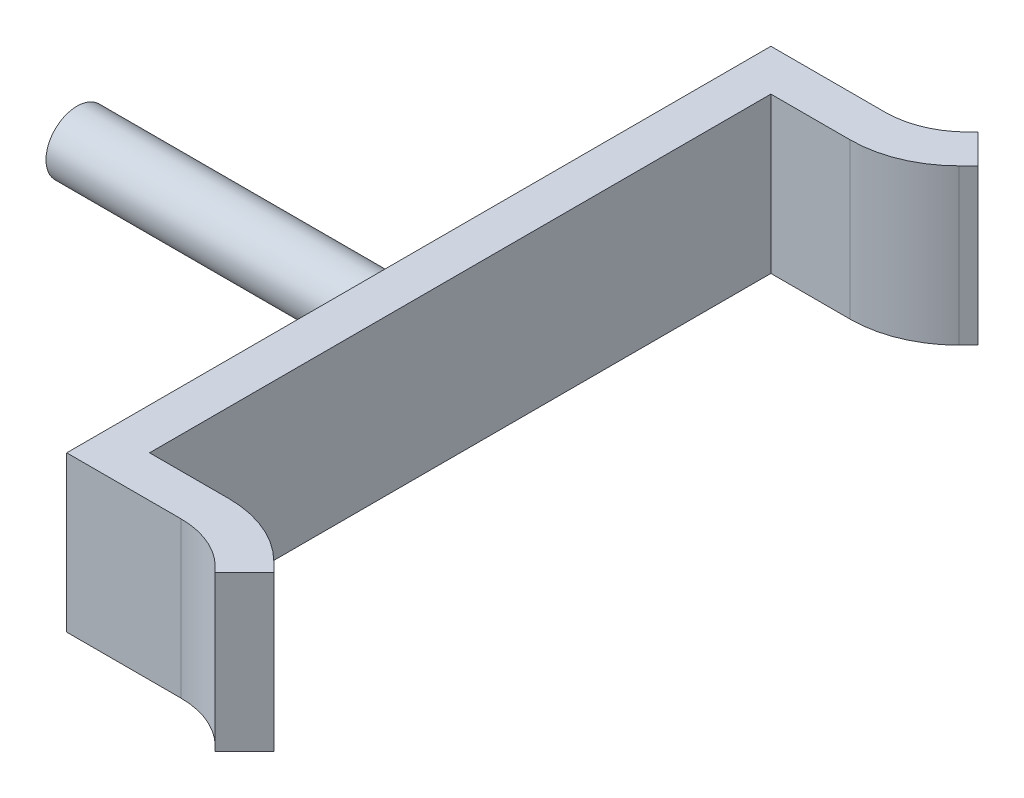
ISO-10303-21;
HEADER;
FILE_DESCRIPTION(('STEP AP214'),'2;1');
FILE_NAME('part.step','',(''),(''),'','','');
FILE_SCHEMA(('AUTOMOTIVE_DESIGN { 1 0 10303 214 1 1 1 1 }'));
ENDSEC;
DATA;
#1=APPLICATION_CONTEXT('core data for automotive mechanical design processes');
#2=APPLICATION_PROTOCOL_DEFINITION('international standard','automotive_design',2000,#1);
#3=PRODUCT_CONTEXT('',#1,'mechanical');
#4=PRODUCT('Part','Part','',(#3));
#5=PRODUCT_RELATED_PRODUCT_CATEGORY('part','',(#4));
#6=PRODUCT_DEFINITION_FORMATION('','',#4);
#7=PRODUCT_DEFINITION_CONTEXT('part definition',#1,'design');
#8=PRODUCT_DEFINITION('design','',#6,#7);
#9=PRODUCT_DEFINITION_SHAPE('','',#8);
#10=(LENGTH_UNIT() NAMED_UNIT(*) SI_UNIT(.MILLI.,.METRE.));
#11=(NAMED_UNIT(*) PLANE_ANGLE_UNIT() SI_UNIT($,.RADIAN.));
#12=(NAMED_UNIT(*) SI_UNIT($,.STERADIAN.) SOLID_ANGLE_UNIT());
#13=UNCERTAINTY_MEASURE_WITH_UNIT(LENGTH_MEASURE(1.E-05),#10,'distance_accuracy_value','');
#14=(GEOMETRIC_REPRESENTATION_CONTEXT(3) GLOBAL_UNCERTAINTY_ASSIGNED_CONTEXT((#13)) GLOBAL_UNIT_ASSIGNED_CONTEXT((#10,
#11,#12)) REPRESENTATION_CONTEXT('',''));
#15=CARTESIAN_POINT('',(0.,0.,0.));
#16=DIRECTION('',(0.,0.,1.));
#17=DIRECTION('',(1.,0.,0.));
#18=AXIS2_PLACEMENT_3D('',#15,#16,#17);
#19=CARTESIAN_POINT('',(11.0294372515229,15.,-42.));
#20=DIRECTION('',(0.,-1.,0.));
#21=DIRECTION('',(0.,0.,-1.));
#22=AXIS2_PLACEMENT_3D('',#19,#20,#21);
#23=CYLINDRICAL_SURFACE('',#22,8.);
#24=CARTESIAN_POINT('',(11.0294372515229,0.,-42.));
#25=DIRECTION('',(0.,1.,0.));
#26=DIRECTION('',(0.,0.,1.));
#27=AXIS2_PLACEMENT_3D('',#24,#25,#26);
#28=CIRCLE('',#27,8.);
#29=CARTESIAN_POINT('',(11.0294372515229,0.,-34.));
#30=VERTEX_POINT('',#29);
#31=CARTESIAN_POINT('',(16.6862915010152,0.,-36.3431457505076));
#32=VERTEX_POINT('',#31);
#33=EDGE_CURVE('E182',#30,#32,#28,.T.);
#34=ORIENTED_EDGE('',*,*,#33,.F.);
#35=DIRECTION('',(0.,-1.,0.));
#36=VECTOR('',#35,1.);
#37=CARTESIAN_POINT('',(11.0294372515229,15.,-34.));
#38=LINE('',#37,#36);
#39=CARTESIAN_POINT('',(11.0294372515229,15.,-34.));
#40=VERTEX_POINT('',#39);
#41=EDGE_CURVE('E11',#40,#30,#38,.T.);
#42=ORIENTED_EDGE('',*,*,#41,.F.);
#43=CARTESIAN_POINT('',(11.0294372515229,15.,-42.));
#44=DIRECTION('',(0.,1.,0.));
#45=DIRECTION('',(0.,0.,1.));
#46=AXIS2_PLACEMENT_3D('',#43,#44,#45);
#47=CIRCLE('',#46,8.);
#48=CARTESIAN_POINT('',(16.6862915010152,15.,-36.3431457505076));
#49=VERTEX_POINT('',#48);
#50=EDGE_CURVE('E221',#40,#49,#47,.T.);
#51=ORIENTED_EDGE('',*,*,#50,.T.);
#52=DIRECTION('',(0.,-1.,0.));
#53=VECTOR('',#52,1.);
#54=CARTESIAN_POINT('',(16.6862915010152,15.,-36.3431457505076));
#55=LINE('',#54,#53);
#56=EDGE_CURVE('E57',#49,#32,#55,.T.);
#57=ORIENTED_EDGE('',*,*,#56,.T.);
#58=EDGE_LOOP('',(#34,#42,#51,#57));
#59=FACE_BOUND('',#58,.T.);
#60=ADVANCED_FACE('F41',(#59),#23,.F.);
#61=CARTESIAN_POINT('',(0.,15.,-34.));
#62=DIRECTION('',(0.,0.,-1.));
#63=DIRECTION('',(-1.,0.,0.));
#64=AXIS2_PLACEMENT_3D('',#61,#62,#63);
#65=PLANE('',#64);
#66=DIRECTION('',(1.,0.,0.));
#67=VECTOR('',#66,1.);
#68=CARTESIAN_POINT('',(0.,0.,-34.));
#69=LINE('',#68,#67);
#70=CARTESIAN_POINT('',(0.,0.,-34.));
#71=VERTEX_POINT('',#70);
#72=EDGE_CURVE('E184',#71,#30,#69,.T.);
#73=ORIENTED_EDGE('',*,*,#72,.F.);
#74=DIRECTION('',(0.,-1.,0.));
#75=VECTOR('',#74,1.);
#76=CARTESIAN_POINT('',(0.,15.,-34.));
#77=LINE('',#76,#75);
#78=CARTESIAN_POINT('',(0.,15.,-34.));
#79=VERTEX_POINT('',#78);
#80=EDGE_CURVE('E49',#79,#71,#77,.T.);
#81=ORIENTED_EDGE('',*,*,#80,.F.);
#82=DIRECTION('',(1.,0.,0.));
#83=VECTOR('',#82,1.);
#84=CARTESIAN_POINT('',(0.,15.,-34.));
#85=LINE('',#84,#83);
#86=EDGE_CURVE('E425',#79,#40,#85,.T.);
#87=ORIENTED_EDGE('',*,*,#86,.T.);
#88=ORIENTED_EDGE('',*,*,#41,.T.);
#89=EDGE_LOOP('',(#73,#81,#87,#88));
#90=FACE_BOUND('',#89,.T.);
#91=ADVANCED_FACE('F260',(#90),#65,.T.);
#92=CARTESIAN_POINT('',(0.,15.,0.));
#93=DIRECTION('',(-1.,0.,0.));
#94=DIRECTION('',(0.,0.,1.));
#95=AXIS2_PLACEMENT_3D('',#92,#93,#94);
#96=PLANE('',#95);
#97=CARTESIAN_POINT('',(0.,7.5,0.));
#98=DIRECTION('',(-1.,0.,0.));
#99=DIRECTION('',(0.,0.,1.));
#100=AXIS2_PLACEMENT_3D('',#97,#98,#99);
#101=CIRCLE('',#100,3.);
#102=CARTESIAN_POINT('',(0.,7.5,3.));
#103=VERTEX_POINT('',#102);
#104=EDGE_CURVE('E419',#103,#103,#101,.T.);
#105=ORIENTED_EDGE('',*,*,#104,.F.);
#106=EDGE_LOOP('',(#105));
#107=FACE_BOUND('',#106,.T.);
#108=DIRECTION('',(0.,0.,-1.));
#109=VECTOR('',#108,1.);
#110=CARTESIAN_POINT('',(0.,0.,0.));
#111=LINE('',#110,#109);
#112=CARTESIAN_POINT('',(0.,0.,34.));
#113=VERTEX_POINT('',#112);
#114=EDGE_CURVE('E188',#113,#71,#111,.T.);
#115=ORIENTED_EDGE('',*,*,#114,.F.);
#116=DIRECTION('',(0.,-1.,0.));
#117=VECTOR('',#116,1.);
#118=CARTESIAN_POINT('',(0.,15.,34.));
#119=LINE('',#118,#117);
#120=CARTESIAN_POINT('',(0.,15.,34.));
#121=VERTEX_POINT('',#120);
#122=EDGE_CURVE('E249',#121,#113,#119,.T.);
#123=ORIENTED_EDGE('',*,*,#122,.F.);
#124=DIRECTION('',(0.,0.,-1.));
#125=VECTOR('',#124,1.);
#126=CARTESIAN_POINT('',(0.,15.,0.));
#127=LINE('',#126,#125);
#128=EDGE_CURVE('E256',#121,#79,#127,.T.);
#129=ORIENTED_EDGE('',*,*,#128,.T.);
#130=ORIENTED_EDGE('',*,*,#80,.T.);
#131=EDGE_LOOP('',(#115,#123,#129,#130));
#132=FACE_BOUND('',#131,.T.);
#133=ADVANCED_FACE('F254',(#107,#132),#96,.T.);
#134=CARTESIAN_POINT('',(0.,15.,34.));
#135=DIRECTION('',(0.,0.,-1.));
#136=DIRECTION('',(-1.,0.,0.));
#137=AXIS2_PLACEMENT_3D('',#134,#135,#136);
#138=PLANE('',#137);
#139=DIRECTION('',(1.,0.,0.));
#140=VECTOR('',#139,1.);
#141=CARTESIAN_POINT('',(0.,0.,34.));
#142=LINE('',#141,#140);
#143=CARTESIAN_POINT('',(11.0294372515229,0.,34.));
#144=VERTEX_POINT('',#143);
#145=EDGE_CURVE('E191',#113,#144,#142,.T.);
#146=ORIENTED_EDGE('',*,*,#145,.T.);
#147=DIRECTION('',(0.,-1.,0.));
#148=VECTOR('',#147,1.);
#149=CARTESIAN_POINT('',(11.0294372515229,15.,34.));
#150=LINE('',#149,#148);
#151=CARTESIAN_POINT('',(11.0294372515229,15.,34.));
#152=VERTEX_POINT('',#151);
#153=EDGE_CURVE('E246',#152,#144,#150,.T.);
#154=ORIENTED_EDGE('',*,*,#153,.F.);
#155=DIRECTION('',(1.,0.,0.));
#156=VECTOR('',#155,1.);
#157=CARTESIAN_POINT('',(0.,15.,34.));
#158=LINE('',#157,#156);
#159=EDGE_CURVE('E277',#121,#152,#158,.T.);
#160=ORIENTED_EDGE('',*,*,#159,.F.);
#161=ORIENTED_EDGE('',*,*,#122,.T.);
#162=EDGE_LOOP('',(#146,#154,#160,#161));
#163=FACE_BOUND('',#162,.T.);
#164=ADVANCED_FACE('F268',(#163),#138,.F.);
#165=CARTESIAN_POINT('',(11.0294372515229,15.,42.));
#166=DIRECTION('',(0.,-1.,0.));
#167=DIRECTION('',(0.,0.,-1.));
#168=AXIS2_PLACEMENT_3D('',#165,#166,#167);
#169=CYLINDRICAL_SURFACE('',#168,8.);
#170=CARTESIAN_POINT('',(11.0294372515229,0.,42.));
#171=DIRECTION('',(0.,1.,0.));
#172=DIRECTION('',(0.,0.,1.));
#173=AXIS2_PLACEMENT_3D('',#170,#171,#172);
#174=CIRCLE('',#173,8.);
#175=CARTESIAN_POINT('',(16.6862915010152,0.,36.3431457505076));
#176=VERTEX_POINT('',#175);
#177=EDGE_CURVE('E193',#144,#176,#174,.F.);
#178=ORIENTED_EDGE('',*,*,#177,.T.);
#179=DIRECTION('',(0.,-1.,0.));
#180=VECTOR('',#179,1.);
#181=CARTESIAN_POINT('',(16.6862915010152,15.,36.3431457505076));
#182=LINE('',#181,#180);
#183=CARTESIAN_POINT('',(16.6862915010152,15.,36.3431457505076));
#184=VERTEX_POINT('',#183);
#185=EDGE_CURVE('E243',#184,#176,#182,.T.);
#186=ORIENTED_EDGE('',*,*,#185,.F.);
#187=CARTESIAN_POINT('',(11.0294372515229,15.,42.));
#188=DIRECTION('',(0.,1.,0.));
#189=DIRECTION('',(0.,0.,1.));
#190=AXIS2_PLACEMENT_3D('',#187,#188,#189);
#191=CIRCLE('',#190,8.);
#192=EDGE_CURVE('E274',#152,#184,#191,.F.);
#193=ORIENTED_EDGE('',*,*,#192,.F.);
#194=ORIENTED_EDGE('',*,*,#153,.T.);
#195=EDGE_LOOP('',(#178,#186,#193,#194));
#196=FACE_BOUND('',#195,.T.);
#197=ADVANCED_FACE('F272',(#196),#169,.F.);
#198=CARTESIAN_POINT('',(-9.82842712474619,15.,9.82842712474619));
#199=DIRECTION('',(0.707106781186547,0.,-0.707106781186547));
#200=DIRECTION('',(-0.707106781186548,0.,-0.707106781186548));
#201=AXIS2_PLACEMENT_3D('',#198,#199,#200);
#202=PLANE('',#201);
#203=DIRECTION('',(0.707106781186548,0.,0.707106781186548));
#204=VECTOR('',#203,1.);
#205=CARTESIAN_POINT('',(-9.82842712474619,0.,9.82842712474619));
#206=LINE('',#205,#204);
#207=CARTESIAN_POINT('',(17.1715728752538,0.,36.8284271247462));
#208=VERTEX_POINT('',#207);
#209=EDGE_CURVE('E195',#176,#208,#206,.T.);
#210=ORIENTED_EDGE('',*,*,#209,.T.);
#211=DIRECTION('',(0.,-1.,0.));
#212=VECTOR('',#211,1.);
#213=CARTESIAN_POINT('',(17.1715728752538,15.,36.8284271247462));
#214=LINE('',#213,#212);
#215=CARTESIAN_POINT('',(17.1715728752538,15.,36.8284271247462));
#216=VERTEX_POINT('',#215);
#217=EDGE_CURVE('E240',#216,#208,#214,.T.);
#218=ORIENTED_EDGE('',*,*,#217,.F.);
#219=DIRECTION('',(0.707106781186548,0.,0.707106781186548));
#220=VECTOR('',#219,1.);
#221=CARTESIAN_POINT('',(-9.82842712474619,15.,9.82842712474619));
#222=LINE('',#221,#220);
#223=EDGE_CURVE('E276',#184,#216,#222,.T.);
#224=ORIENTED_EDGE('',*,*,#223,.F.);
#225=ORIENTED_EDGE('',*,*,#185,.T.);
#226=EDGE_LOOP('',(#210,#218,#224,#225));
#227=FACE_BOUND('',#226,.T.);
#228=ADVANCED_FACE('F324',(#227),#202,.F.);
#229=CARTESIAN_POINT('',(27.,15.,27.));
#230=DIRECTION('',(-0.707106781186547,0.,-0.707106781186547));
#231=DIRECTION('',(-0.707106781186548,0.,0.707106781186548));
#232=AXIS2_PLACEMENT_3D('',#229,#230,#231);
#233=PLANE('',#232);
#234=DIRECTION('',(0.707106781186548,0.,-0.707106781186548));
#235=VECTOR('',#234,1.);
#236=CARTESIAN_POINT('',(27.,0.,27.));
#237=LINE('',#236,#235);
#238=CARTESIAN_POINT('',(20.,0.,34.));
#239=VERTEX_POINT('',#238);
#240=EDGE_CURVE('E197',#208,#239,#237,.T.);
#241=ORIENTED_EDGE('',*,*,#240,.T.);
#242=DIRECTION('',(0.,-1.,0.));
#243=VECTOR('',#242,1.);
#244=CARTESIAN_POINT('',(20.,15.,34.));
#245=LINE('',#244,#243);
#246=CARTESIAN_POINT('',(20.,15.,34.));
#247=VERTEX_POINT('',#246);
#248=EDGE_CURVE('E237',#247,#239,#245,.T.);
#249=ORIENTED_EDGE('',*,*,#248,.F.);
#250=DIRECTION('',(0.707106781186548,0.,-0.707106781186548));
#251=VECTOR('',#250,1.);
#252=CARTESIAN_POINT('',(27.,15.,27.));
#253=LINE('',#252,#251);
#254=EDGE_CURVE('E279',#216,#247,#253,.T.);
#255=ORIENTED_EDGE('',*,*,#254,.F.);
#256=ORIENTED_EDGE('',*,*,#217,.T.);
#257=EDGE_LOOP('',(#241,#249,#255,#256));
#258=FACE_BOUND('',#257,.T.);
#259=ADVANCED_FACE('F327',(#258),#233,.F.);
#260=CARTESIAN_POINT('',(-7.00000000000004,15.,7.00000000000006));
#261=DIRECTION('',(-0.707106781186546,0.,0.707106781186549));
#262=DIRECTION('',(0.707106781186549,0.,0.707106781186546));
#263=AXIS2_PLACEMENT_3D('',#260,#261,#262);
#264=PLANE('',#263);
#265=DIRECTION('',(-0.707106781186549,0.,-0.707106781186546));
#266=VECTOR('',#265,1.);
#267=CARTESIAN_POINT('',(-7.00000000000004,0.,7.00000000000006));
#268=LINE('',#267,#266);
#269=CARTESIAN_POINT('',(19.0753787975412,0.,33.0753787975412));
#270=VERTEX_POINT('',#269);
#271=EDGE_CURVE('E199',#239,#270,#268,.T.);
#272=ORIENTED_EDGE('',*,*,#271,.T.);
#273=DIRECTION('',(0.,-1.,0.));
#274=VECTOR('',#273,1.);
#275=CARTESIAN_POINT('',(19.0753787975412,15.,33.0753787975412));
#276=LINE('',#275,#274);
#277=CARTESIAN_POINT('',(19.0753787975412,15.,33.0753787975412));
#278=VERTEX_POINT('',#277);
#279=EDGE_CURVE('E234',#278,#270,#276,.T.);
#280=ORIENTED_EDGE('',*,*,#279,.F.);
#281=DIRECTION('',(-0.707106781186549,0.,-0.707106781186546));
#282=VECTOR('',#281,1.);
#283=CARTESIAN_POINT('',(-7.00000000000004,15.,7.00000000000006));
#284=LINE('',#283,#282);
#285=EDGE_CURVE('E285',#247,#278,#284,.T.);
#286=ORIENTED_EDGE('',*,*,#285,.F.);
#287=ORIENTED_EDGE('',*,*,#248,.T.);
#288=EDGE_LOOP('',(#272,#280,#286,#287));
#289=FACE_BOUND('',#288,.T.);
#290=ADVANCED_FACE('F331',(#289),#264,.F.);
#291=CARTESIAN_POINT('',(11.6507575950825,15.,40.5));
#292=DIRECTION('',(0.,-1.,0.));
#293=DIRECTION('',(0.,0.,-1.));
#294=AXIS2_PLACEMENT_3D('',#291,#292,#293);
#295=CYLINDRICAL_SURFACE('',#294,10.5);
#296=CARTESIAN_POINT('',(11.6507575950825,0.,40.5));
#297=DIRECTION('',(0.,1.,0.));
#298=DIRECTION('',(0.,0.,1.));
#299=AXIS2_PLACEMENT_3D('',#296,#297,#298);
#300=CIRCLE('',#299,10.5);
#301=CARTESIAN_POINT('',(11.6507575950825,0.,30.));
#302=VERTEX_POINT('',#301);
#303=EDGE_CURVE('E201',#270,#302,#300,.T.);
#304=ORIENTED_EDGE('',*,*,#303,.T.);
#305=DIRECTION('',(0.,-1.,0.));
#306=VECTOR('',#305,1.);
#307=CARTESIAN_POINT('',(11.6507575950825,15.,30.));
#308=LINE('',#307,#306);
#309=CARTESIAN_POINT('',(11.6507575950825,15.,30.));
#310=VERTEX_POINT('',#309);
#311=EDGE_CURVE('E231',#310,#302,#308,.T.);
#312=ORIENTED_EDGE('',*,*,#311,.F.);
#313=CARTESIAN_POINT('',(11.6507575950825,15.,40.5));
#314=DIRECTION('',(0.,1.,0.));
#315=DIRECTION('',(0.,0.,1.));
#316=AXIS2_PLACEMENT_3D('',#313,#314,#315);
#317=CIRCLE('',#316,10.5);
#318=EDGE_CURVE('E287',#278,#310,#317,.T.);
#319=ORIENTED_EDGE('',*,*,#318,.F.);
#320=ORIENTED_EDGE('',*,*,#279,.T.);
#321=EDGE_LOOP('',(#304,#312,#319,#320));
#322=FACE_BOUND('',#321,.T.);
#323=ADVANCED_FACE('F335',(#322),#295,.T.);
#324=CARTESIAN_POINT('',(0.,15.,30.));
#325=DIRECTION('',(0.,0.,1.));
#326=DIRECTION('',(1.,0.,0.));
#327=AXIS2_PLACEMENT_3D('',#324,#325,#326);
#328=PLANE('',#327);
#329=DIRECTION('',(-1.,0.,0.));
#330=VECTOR('',#329,1.);
#331=CARTESIAN_POINT('',(0.,0.,30.));
#332=LINE('',#331,#330);
#333=CARTESIAN_POINT('',(4.00000000000001,0.,30.));
#334=VERTEX_POINT('',#333);
#335=EDGE_CURVE('E203',#302,#334,#332,.T.);
#336=ORIENTED_EDGE('',*,*,#335,.T.);
#337=DIRECTION('',(0.,-1.,0.));
#338=VECTOR('',#337,1.);
#339=CARTESIAN_POINT('',(4.00000000000001,15.,30.));
#340=LINE('',#339,#338);
#341=CARTESIAN_POINT('',(4.00000000000001,15.,30.));
#342=VERTEX_POINT('',#341);
#343=EDGE_CURVE('E229',#342,#334,#340,.T.);
#344=ORIENTED_EDGE('',*,*,#343,.F.);
#345=DIRECTION('',(-1.,0.,0.));
#346=VECTOR('',#345,1.);
#347=CARTESIAN_POINT('',(0.,15.,30.));
#348=LINE('',#347,#346);
#349=EDGE_CURVE('E289',#310,#342,#348,.T.);
#350=ORIENTED_EDGE('',*,*,#349,.F.);
#351=ORIENTED_EDGE('',*,*,#311,.T.);
#352=EDGE_LOOP('',(#336,#344,#350,#351));
#353=FACE_BOUND('',#352,.T.);
#354=ADVANCED_FACE('F339',(#353),#328,.F.);
#355=CARTESIAN_POINT('',(4.,15.,0.));
#356=DIRECTION('',(1.,0.,0.));
#357=DIRECTION('',(0.,0.,-1.));
#358=AXIS2_PLACEMENT_3D('',#355,#356,#357);
#359=PLANE('',#358);
#360=DIRECTION('',(0.,0.,1.));
#361=VECTOR('',#360,1.);
#362=CARTESIAN_POINT('',(4.,0.,0.));
#363=LINE('',#362,#361);
#364=CARTESIAN_POINT('',(4.,0.,-30.));
#365=VERTEX_POINT('',#364);
#366=EDGE_CURVE('E206',#365,#334,#363,.T.);
#367=ORIENTED_EDGE('',*,*,#366,.F.);
#368=DIRECTION('',(0.,-1.,0.));
#369=VECTOR('',#368,1.);
#370=CARTESIAN_POINT('',(4.,15.,-30.));
#371=LINE('',#370,#369);
#372=CARTESIAN_POINT('',(4.,15.,-30.));
#373=VERTEX_POINT('',#372);
#374=EDGE_CURVE('E227',#373,#365,#371,.T.);
#375=ORIENTED_EDGE('',*,*,#374,.F.);
#376=DIRECTION('',(0.,0.,1.));
#377=VECTOR('',#376,1.);
#378=CARTESIAN_POINT('',(4.,15.,0.));
#379=LINE('',#378,#377);
#380=EDGE_CURVE('E291',#373,#342,#379,.T.);
#381=ORIENTED_EDGE('',*,*,#380,.T.);
#382=ORIENTED_EDGE('',*,*,#343,.T.);
#383=EDGE_LOOP('',(#367,#375,#381,#382));
#384=FACE_BOUND('',#383,.T.);
#385=ADVANCED_FACE('F343',(#384),#359,.T.);
#386=CARTESIAN_POINT('',(0.,15.,-30.));
#387=DIRECTION('',(0.,0.,1.));
#388=DIRECTION('',(1.,0.,0.));
#389=AXIS2_PLACEMENT_3D('',#386,#387,#388);
#390=PLANE('',#389);
#391=DIRECTION('',(-1.,0.,0.));
#392=VECTOR('',#391,1.);
#393=CARTESIAN_POINT('',(0.,0.,-30.));
#394=LINE('',#393,#392);
#395=CARTESIAN_POINT('',(11.6507575950825,0.,-30.));
#396=VERTEX_POINT('',#395);
#397=EDGE_CURVE('E209',#396,#365,#394,.T.);
#398=ORIENTED_EDGE('',*,*,#397,.F.);
#399=DIRECTION('',(0.,-1.,0.));
#400=VECTOR('',#399,1.);
#401=CARTESIAN_POINT('',(11.6507575950825,15.,-30.));
#402=LINE('',#401,#400);
#403=CARTESIAN_POINT('',(11.6507575950825,15.,-30.));
#404=VERTEX_POINT('',#403);
#405=EDGE_CURVE('E225',#404,#396,#402,.T.);
#406=ORIENTED_EDGE('',*,*,#405,.F.);
#407=DIRECTION('',(-1.,0.,0.));
#408=VECTOR('',#407,1.);
#409=CARTESIAN_POINT('',(0.,15.,-30.));
#410=LINE('',#409,#408);
#411=EDGE_CURVE('E294',#404,#373,#410,.T.);
#412=ORIENTED_EDGE('',*,*,#411,.T.);
#413=ORIENTED_EDGE('',*,*,#374,.T.);
#414=EDGE_LOOP('',(#398,#406,#412,#413));
#415=FACE_BOUND('',#414,.T.);
#416=ADVANCED_FACE('F347',(#415),#390,.T.);
#417=CARTESIAN_POINT('',(11.6507575950825,15.,-40.5));
#418=DIRECTION('',(0.,-1.,0.));
#419=DIRECTION('',(0.,0.,-1.));
#420=AXIS2_PLACEMENT_3D('',#417,#418,#419);
#421=CYLINDRICAL_SURFACE('',#420,10.5);
#422=CARTESIAN_POINT('',(11.6507575950825,0.,-40.5));
#423=DIRECTION('',(0.,1.,0.));
#424=DIRECTION('',(0.,0.,1.));
#425=AXIS2_PLACEMENT_3D('',#422,#423,#424);
#426=CIRCLE('',#425,10.5);
#427=CARTESIAN_POINT('',(19.0753787975412,0.,-33.0753787975412));
#428=VERTEX_POINT('',#427);
#429=EDGE_CURVE('E212',#428,#396,#426,.F.);
#430=ORIENTED_EDGE('',*,*,#429,.F.);
#431=DIRECTION('',(0.,-1.,0.));
#432=VECTOR('',#431,1.);
#433=CARTESIAN_POINT('',(19.0753787975412,15.,-33.0753787975412));
#434=LINE('',#433,#432);
#435=CARTESIAN_POINT('',(19.0753787975412,15.,-33.0753787975412));
#436=VERTEX_POINT('',#435);
#437=EDGE_CURVE('E164',#436,#428,#434,.T.);
#438=ORIENTED_EDGE('',*,*,#437,.F.);
#439=CARTESIAN_POINT('',(11.6507575950825,15.,-40.5));
#440=DIRECTION('',(0.,1.,0.));
#441=DIRECTION('',(0.,0.,1.));
#442=AXIS2_PLACEMENT_3D('',#439,#440,#441);
#443=CIRCLE('',#442,10.5);
#444=EDGE_CURVE('E174',#436,#404,#443,.F.);
#445=ORIENTED_EDGE('',*,*,#444,.T.);
#446=ORIENTED_EDGE('',*,*,#405,.T.);
#447=EDGE_LOOP('',(#430,#438,#445,#446));
#448=FACE_BOUND('',#447,.T.);
#449=ADVANCED_FACE('F298',(#448),#421,.T.);
#450=CARTESIAN_POINT('',(-7.00000000000004,15.,-7.00000000000007));
#451=DIRECTION('',(0.707106781186546,0.,0.707106781186549));
#452=DIRECTION('',(0.707106781186549,0.,-0.707106781186546));
#453=AXIS2_PLACEMENT_3D('',#450,#451,#452);
#454=PLANE('',#453);
#455=DIRECTION('',(-0.707106781186549,0.,0.707106781186546));
#456=VECTOR('',#455,1.);
#457=CARTESIAN_POINT('',(-7.00000000000004,0.,-7.00000000000007));
#458=LINE('',#457,#456);
#459=CARTESIAN_POINT('',(20.,0.,-34.));
#460=VERTEX_POINT('',#459);
#461=EDGE_CURVE('E160',#460,#428,#458,.T.);
#462=ORIENTED_EDGE('',*,*,#461,.F.);
#463=DIRECTION('',(0.,-1.,0.));
#464=VECTOR('',#463,1.);
#465=CARTESIAN_POINT('',(20.,15.,-34.));
#466=LINE('',#465,#464);
#467=CARTESIAN_POINT('',(20.,15.,-34.));
#468=VERTEX_POINT('',#467);
#469=EDGE_CURVE('E155',#468,#460,#466,.T.);
#470=ORIENTED_EDGE('',*,*,#469,.F.);
#471=DIRECTION('',(-0.707106781186549,0.,0.707106781186546));
#472=VECTOR('',#471,1.);
#473=CARTESIAN_POINT('',(-7.00000000000004,15.,-7.00000000000007));
#474=LINE('',#473,#472);
#475=EDGE_CURVE('E158',#468,#436,#474,.T.);
#476=ORIENTED_EDGE('',*,*,#475,.T.);
#477=ORIENTED_EDGE('',*,*,#437,.T.);
#478=EDGE_LOOP('',(#462,#470,#476,#477));
#479=FACE_BOUND('',#478,.T.);
#480=ADVANCED_FACE('F157',(#479),#454,.T.);
#481=CARTESIAN_POINT('',(27.,15.,-27.));
#482=DIRECTION('',(0.707106781186547,0.,-0.707106781186548));
#483=DIRECTION('',(-0.707106781186548,0.,-0.707106781186547));
#484=AXIS2_PLACEMENT_3D('',#481,#482,#483);
#485=PLANE('',#484);
#486=DIRECTION('',(0.707106781186548,0.,0.707106781186547));
#487=VECTOR('',#486,1.);
#488=CARTESIAN_POINT('',(27.,0.,-27.));
#489=LINE('',#488,#487);
#490=CARTESIAN_POINT('',(17.1715728752538,0.,-36.8284271247462));
#491=VERTEX_POINT('',#490);
#492=EDGE_CURVE('E216',#491,#460,#489,.T.);
#493=ORIENTED_EDGE('',*,*,#492,.F.);
#494=DIRECTION('',(0.,-1.,0.));
#495=VECTOR('',#494,1.);
#496=CARTESIAN_POINT('',(17.1715728752538,15.,-36.8284271247462));
#497=LINE('',#496,#495);
#498=CARTESIAN_POINT('',(17.1715728752538,15.,-36.8284271247462));
#499=VERTEX_POINT('',#498);
#500=EDGE_CURVE('E106',#499,#491,#497,.T.);
#501=ORIENTED_EDGE('',*,*,#500,.F.);
#502=DIRECTION('',(0.707106781186548,0.,0.707106781186547));
#503=VECTOR('',#502,1.);
#504=CARTESIAN_POINT('',(27.,15.,-27.));
#505=LINE('',#504,#503);
#506=EDGE_CURVE('E171',#499,#468,#505,.T.);
#507=ORIENTED_EDGE('',*,*,#506,.T.);
#508=ORIENTED_EDGE('',*,*,#469,.T.);
#509=EDGE_LOOP('',(#493,#501,#507,#508));
#510=FACE_BOUND('',#509,.T.);
#511=ADVANCED_FACE('F176',(#510),#485,.T.);
#512=CARTESIAN_POINT('',(-9.82842712474619,15.,-9.82842712474619));
#513=DIRECTION('',(-0.707106781186547,0.,-0.707106781186547));
#514=DIRECTION('',(-0.707106781186548,0.,0.707106781186548));
#515=AXIS2_PLACEMENT_3D('',#512,#513,#514);
#516=PLANE('',#515);
#517=DIRECTION('',(0.707106781186548,0.,-0.707106781186548));
#518=VECTOR('',#517,1.);
#519=CARTESIAN_POINT('',(-9.82842712474619,0.,-9.82842712474619));
#520=LINE('',#519,#518);
#521=EDGE_CURVE('E218',#32,#491,#520,.T.);
#522=ORIENTED_EDGE('',*,*,#521,.F.);
#523=ORIENTED_EDGE('',*,*,#56,.F.);
#524=DIRECTION('',(0.707106781186548,0.,-0.707106781186548));
#525=VECTOR('',#524,1.);
#526=CARTESIAN_POINT('',(-9.82842712474619,15.,-9.82842712474619));
#527=LINE('',#526,#525);
#528=EDGE_CURVE('E177',#49,#499,#527,.T.);
#529=ORIENTED_EDGE('',*,*,#528,.T.);
#530=ORIENTED_EDGE('',*,*,#500,.T.);
#531=EDGE_LOOP('',(#522,#523,#529,#530));
#532=FACE_BOUND('',#531,.T.);
#533=ADVANCED_FACE('F300',(#532),#516,.T.);
#534=CARTESIAN_POINT('',(0.,15.,0.));
#535=DIRECTION('',(0.,1.,0.));
#536=DIRECTION('',(0.,0.,1.));
#537=AXIS2_PLACEMENT_3D('',#534,#535,#536);
#538=PLANE('',#537);
#539=ORIENTED_EDGE('',*,*,#50,.F.);
#540=ORIENTED_EDGE('',*,*,#86,.F.);
#541=ORIENTED_EDGE('',*,*,#128,.F.);
#542=ORIENTED_EDGE('',*,*,#159,.T.);
#543=ORIENTED_EDGE('',*,*,#192,.T.);
#544=ORIENTED_EDGE('',*,*,#223,.T.);
#545=ORIENTED_EDGE('',*,*,#254,.T.);
#546=ORIENTED_EDGE('',*,*,#285,.T.);
#547=ORIENTED_EDGE('',*,*,#318,.T.);
#548=ORIENTED_EDGE('',*,*,#349,.T.);
#549=ORIENTED_EDGE('',*,*,#380,.F.);
#550=ORIENTED_EDGE('',*,*,#411,.F.);
#551=ORIENTED_EDGE('',*,*,#444,.F.);
#552=ORIENTED_EDGE('',*,*,#475,.F.);
#553=ORIENTED_EDGE('',*,*,#506,.F.);
#554=ORIENTED_EDGE('',*,*,#528,.F.);
#555=EDGE_LOOP('',(#539,#540,#541,#542,#543,#544,#545,#546,#547,#548,#549,#550,#551,#552,#553,#554));
#556=FACE_BOUND('',#555,.T.);
#557=ADVANCED_FACE('F169',(#556),#538,.T.);
#558=CARTESIAN_POINT('',(0.,0.,0.));
#559=DIRECTION('',(0.,1.,0.));
#560=DIRECTION('',(0.,0.,1.));
#561=AXIS2_PLACEMENT_3D('',#558,#559,#560);
#562=PLANE('',#561);
#563=ORIENTED_EDGE('',*,*,#33,.T.);
#564=ORIENTED_EDGE('',*,*,#521,.T.);
#565=ORIENTED_EDGE('',*,*,#492,.T.);
#566=ORIENTED_EDGE('',*,*,#461,.T.);
#567=ORIENTED_EDGE('',*,*,#429,.T.);
#568=ORIENTED_EDGE('',*,*,#397,.T.);
#569=ORIENTED_EDGE('',*,*,#366,.T.);
#570=ORIENTED_EDGE('',*,*,#335,.F.);
#571=ORIENTED_EDGE('',*,*,#303,.F.);
#572=ORIENTED_EDGE('',*,*,#271,.F.);
#573=ORIENTED_EDGE('',*,*,#240,.F.);
#574=ORIENTED_EDGE('',*,*,#209,.F.);
#575=ORIENTED_EDGE('',*,*,#177,.F.);
#576=ORIENTED_EDGE('',*,*,#145,.F.);
#577=ORIENTED_EDGE('',*,*,#114,.T.);
#578=ORIENTED_EDGE('',*,*,#72,.T.);
#579=EDGE_LOOP('',(#563,#564,#565,#566,#567,#568,#569,#570,#571,#572,#573,#574,#575,#576,#577,#578));
#580=FACE_BOUND('',#579,.T.);
#581=ADVANCED_FACE('F263',(#580),#562,.F.);
#582=CARTESIAN_POINT('',(-33.,7.5,0.));
#583=DIRECTION('',(1.,0.,0.));
#584=DIRECTION('',(0.,0.,-1.));
#585=AXIS2_PLACEMENT_3D('',#582,#583,#584);
#586=CYLINDRICAL_SURFACE('',#585,3.);
#587=CARTESIAN_POINT('',(-33.,7.5,0.));
#588=DIRECTION('',(-1.,0.,0.));
#589=DIRECTION('',(0.,0.,1.));
#590=AXIS2_PLACEMENT_3D('',#587,#588,#589);
#591=CIRCLE('',#590,3.);
#592=CARTESIAN_POINT('',(-33.,7.5,3.));
#593=VERTEX_POINT('',#592);
#594=EDGE_CURVE('E185',#593,#593,#591,.T.);
#595=ORIENTED_EDGE('',*,*,#594,.F.);
#596=EDGE_LOOP('',(#595));
#597=FACE_BOUND('',#596,.T.);
#598=ORIENTED_EDGE('',*,*,#104,.T.);
#599=EDGE_LOOP('',(#598));
#600=FACE_BOUND('',#599,.T.);
#601=ADVANCED_FACE('F385',(#597,#600),#586,.T.);
#602=CARTESIAN_POINT('',(-33.,7.5,0.));
#603=DIRECTION('',(-1.,0.,0.));
#604=DIRECTION('',(0.,0.,1.));
#605=AXIS2_PLACEMENT_3D('',#602,#603,#604);
#606=PLANE('',#605);
#607=ORIENTED_EDGE('',*,*,#594,.T.);
#608=EDGE_LOOP('',(#607));
#609=FACE_BOUND('',#608,.T.);
#610=ADVANCED_FACE('F401',(#609),#606,.T.);
#611=CLOSED_SHELL('',(#60,#91,#133,#164,#197,#228,#259,#290,#323,#354,#385,#416,#449,#480,#511,
#533,#557,#581,#601,#610));
#612=MANIFOLD_SOLID_BREP('B2',#611);
#613=ADVANCED_BREP_SHAPE_REPRESENTATION('',(#18,#612),#14);
#614=SHAPE_DEFINITION_REPRESENTATION(#9,#613);
ENDSEC;
END-ISO-10303-21;
